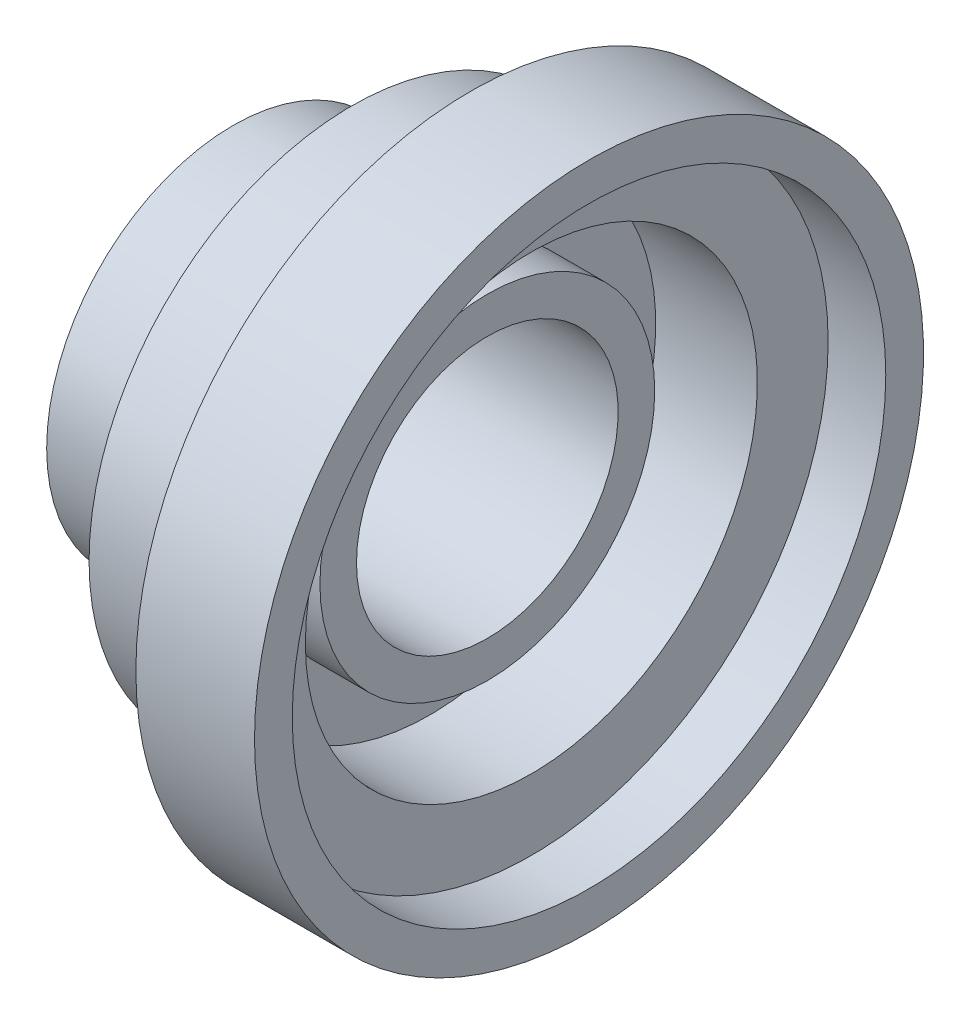
ISO-10303-21;
HEADER;
FILE_DESCRIPTION(('STEP AP214'),'2;1');
FILE_NAME('part.step','',(''),(''),'','','');
FILE_SCHEMA(('AUTOMOTIVE_DESIGN { 1 0 10303 214 1 1 1 1 }'));
ENDSEC;
DATA;
#1=APPLICATION_CONTEXT('core data for automotive mechanical design processes');
#2=APPLICATION_PROTOCOL_DEFINITION('international standard','automotive_design',2000,#1);
#3=PRODUCT_CONTEXT('',#1,'mechanical');
#4=PRODUCT('Part','Part','',(#3));
#5=PRODUCT_RELATED_PRODUCT_CATEGORY('part','',(#4));
#6=PRODUCT_DEFINITION_FORMATION('','',#4);
#7=PRODUCT_DEFINITION_CONTEXT('part definition',#1,'design');
#8=PRODUCT_DEFINITION('design','',#6,#7);
#9=PRODUCT_DEFINITION_SHAPE('','',#8);
#10=(LENGTH_UNIT() NAMED_UNIT(*) SI_UNIT(.MILLI.,.METRE.));
#11=(NAMED_UNIT(*) PLANE_ANGLE_UNIT() SI_UNIT($,.RADIAN.));
#12=(NAMED_UNIT(*) SI_UNIT($,.STERADIAN.) SOLID_ANGLE_UNIT());
#13=UNCERTAINTY_MEASURE_WITH_UNIT(LENGTH_MEASURE(1.E-05),#10,'distance_accuracy_value','');
#14=(GEOMETRIC_REPRESENTATION_CONTEXT(3) GLOBAL_UNCERTAINTY_ASSIGNED_CONTEXT((#13)) GLOBAL_UNIT_ASSIGNED_CONTEXT((#10,
#11,#12)) REPRESENTATION_CONTEXT('',''));
#15=CARTESIAN_POINT('',(0.,0.,0.));
#16=DIRECTION('',(0.,0.,1.));
#17=DIRECTION('',(1.,0.,0.));
#18=AXIS2_PLACEMENT_3D('',#15,#16,#17);
#19=CARTESIAN_POINT('',(0.,-38.5990285898058,0.));
#20=DIRECTION('',(-1.,0.,0.));
#21=DIRECTION('',(0.,0.,1.));
#22=AXIS2_PLACEMENT_3D('',#19,#20,#21);
#23=CYLINDRICAL_SURFACE('',#22,38.5990285898058);
#24=CARTESIAN_POINT('',(75.,-38.5990285898058,0.));
#25=DIRECTION('',(-1.,0.,0.));
#26=DIRECTION('',(0.,0.,1.));
#27=AXIS2_PLACEMENT_3D('',#24,#25,#26);
#28=CIRCLE('',#27,38.5990285898058);
#29=CARTESIAN_POINT('',(75.,-38.5990285898058,38.5990285898058));
#30=VERTEX_POINT('',#29);
#31=EDGE_CURVE('E83',#30,#30,#28,.T.);
#32=ORIENTED_EDGE('',*,*,#31,.F.);
#33=EDGE_LOOP('',(#32));
#34=FACE_BOUND('',#33,.T.);
#35=CARTESIAN_POINT('',(0.,-38.5990285898058,0.));
#36=DIRECTION('',(-1.,0.,0.));
#37=DIRECTION('',(0.,0.,1.));
#38=AXIS2_PLACEMENT_3D('',#35,#36,#37);
#39=CIRCLE('',#38,38.5990285898058);
#40=CARTESIAN_POINT('',(0.,-38.5990285898058,38.5990285898058));
#41=VERTEX_POINT('',#40);
#42=EDGE_CURVE('E10',#41,#41,#39,.T.);
#43=ORIENTED_EDGE('',*,*,#42,.T.);
#44=EDGE_LOOP('',(#43));
#45=FACE_BOUND('',#44,.T.);
#46=ADVANCED_FACE('F37',(#34,#45),#23,.F.);
#47=CARTESIAN_POINT('',(0.,0.,0.));
#48=DIRECTION('',(1.,0.,0.));
#49=DIRECTION('',(0.,0.,-1.));
#50=AXIS2_PLACEMENT_3D('',#47,#48,#49);
#51=PLANE('',#50);
#52=ORIENTED_EDGE('',*,*,#42,.F.);
#53=EDGE_LOOP('',(#52));
#54=FACE_BOUND('',#53,.T.);
#55=CARTESIAN_POINT('',(0.,-38.5990285898058,0.));
#56=DIRECTION('',(-1.,0.,0.));
#57=DIRECTION('',(0.,0.,1.));
#58=AXIS2_PLACEMENT_3D('',#55,#56,#57);
#59=CIRCLE('',#58,55.);
#60=CARTESIAN_POINT('',(0.,-38.5990285898058,55.));
#61=VERTEX_POINT('',#60);
#62=EDGE_CURVE('E43',#61,#61,#59,.T.);
#63=ORIENTED_EDGE('',*,*,#62,.T.);
#64=EDGE_LOOP('',(#63));
#65=FACE_BOUND('',#64,.T.);
#66=ADVANCED_FACE('F90',(#54,#65),#51,.F.);
#67=CARTESIAN_POINT('',(0.,-38.5990285898058,0.));
#68=DIRECTION('',(-1.,0.,0.));
#69=DIRECTION('',(0.,0.,1.));
#70=AXIS2_PLACEMENT_3D('',#67,#68,#69);
#71=CYLINDRICAL_SURFACE('',#70,55.);
#72=ORIENTED_EDGE('',*,*,#62,.F.);
#73=EDGE_LOOP('',(#72));
#74=FACE_BOUND('',#73,.T.);
#75=CARTESIAN_POINT('',(35.,-38.5990285898058,0.));
#76=DIRECTION('',(-1.,0.,0.));
#77=DIRECTION('',(0.,0.,1.));
#78=AXIS2_PLACEMENT_3D('',#75,#76,#77);
#79=CIRCLE('',#78,55.);
#80=CARTESIAN_POINT('',(35.,-38.5990285898058,55.));
#81=VERTEX_POINT('',#80);
#82=EDGE_CURVE('E47',#81,#81,#79,.T.);
#83=ORIENTED_EDGE('',*,*,#82,.T.);
#84=EDGE_LOOP('',(#83));
#85=FACE_BOUND('',#84,.T.);
#86=ADVANCED_FACE('F94',(#74,#85),#71,.T.);
#87=CARTESIAN_POINT('',(35.,16.4009714101942,0.));
#88=DIRECTION('',(1.,0.,0.));
#89=DIRECTION('',(0.,0.,-1.));
#90=AXIS2_PLACEMENT_3D('',#87,#88,#89);
#91=PLANE('',#90);
#92=ORIENTED_EDGE('',*,*,#82,.F.);
#93=EDGE_LOOP('',(#92));
#94=FACE_BOUND('',#93,.T.);
#95=CARTESIAN_POINT('',(35.,-38.5990285898058,0.));
#96=DIRECTION('',(-1.,0.,0.));
#97=DIRECTION('',(0.,0.,1.));
#98=AXIS2_PLACEMENT_3D('',#95,#96,#97);
#99=CIRCLE('',#98,77.5);
#100=CARTESIAN_POINT('',(35.,-38.5990285898058,77.5));
#101=VERTEX_POINT('',#100);
#102=EDGE_CURVE('E51',#101,#101,#99,.T.);
#103=ORIENTED_EDGE('',*,*,#102,.T.);
#104=EDGE_LOOP('',(#103));
#105=FACE_BOUND('',#104,.T.);
#106=ADVANCED_FACE('F99',(#94,#105),#91,.F.);
#107=CARTESIAN_POINT('',(0.,-38.5990285898058,0.));
#108=DIRECTION('',(-1.,0.,0.));
#109=DIRECTION('',(0.,0.,1.));
#110=AXIS2_PLACEMENT_3D('',#107,#108,#109);
#111=CYLINDRICAL_SURFACE('',#110,77.5);
#112=ORIENTED_EDGE('',*,*,#102,.F.);
#113=EDGE_LOOP('',(#112));
#114=FACE_BOUND('',#113,.T.);
#115=CARTESIAN_POINT('',(70.,-38.5990285898058,0.));
#116=DIRECTION('',(-1.,0.,0.));
#117=DIRECTION('',(0.,0.,1.));
#118=AXIS2_PLACEMENT_3D('',#115,#116,#117);
#119=CIRCLE('',#118,77.5);
#120=CARTESIAN_POINT('',(70.,-38.5990285898058,77.5));
#121=VERTEX_POINT('',#120);
#122=EDGE_CURVE('E56',#121,#121,#119,.T.);
#123=ORIENTED_EDGE('',*,*,#122,.T.);
#124=EDGE_LOOP('',(#123));
#125=FACE_BOUND('',#124,.T.);
#126=ADVANCED_FACE('F105',(#114,#125),#111,.T.);
#127=CARTESIAN_POINT('',(70.,38.9009714101942,0.));
#128=DIRECTION('',(1.,0.,0.));
#129=DIRECTION('',(0.,0.,-1.));
#130=AXIS2_PLACEMENT_3D('',#127,#128,#129);
#131=PLANE('',#130);
#132=ORIENTED_EDGE('',*,*,#122,.F.);
#133=EDGE_LOOP('',(#132));
#134=FACE_BOUND('',#133,.T.);
#135=CARTESIAN_POINT('',(70.,-38.5990285898058,0.));
#136=DIRECTION('',(-1.,0.,0.));
#137=DIRECTION('',(0.,0.,1.));
#138=AXIS2_PLACEMENT_3D('',#135,#136,#137);
#139=CIRCLE('',#138,98.6887835516243);
#140=CARTESIAN_POINT('',(70.,-38.5990285898058,98.6887835516243));
#141=VERTEX_POINT('',#140);
#142=EDGE_CURVE('E59',#141,#141,#139,.T.);
#143=ORIENTED_EDGE('',*,*,#142,.T.);
#144=EDGE_LOOP('',(#143));
#145=FACE_BOUND('',#144,.T.);
#146=ADVANCED_FACE('F109',(#134,#145),#131,.F.);
#147=CARTESIAN_POINT('',(0.,-38.5990285898058,0.));
#148=DIRECTION('',(-1.,0.,0.));
#149=DIRECTION('',(0.,0.,1.));
#150=AXIS2_PLACEMENT_3D('',#147,#148,#149);
#151=CYLINDRICAL_SURFACE('',#150,98.6887835516243);
#152=ORIENTED_EDGE('',*,*,#142,.F.);
#153=EDGE_LOOP('',(#152));
#154=FACE_BOUND('',#153,.T.);
#155=CARTESIAN_POINT('',(105.,-38.5990285898058,0.));
#156=DIRECTION('',(-1.,0.,0.));
#157=DIRECTION('',(0.,0.,1.));
#158=AXIS2_PLACEMENT_3D('',#155,#156,#157);
#159=CIRCLE('',#158,98.6887835516243);
#160=CARTESIAN_POINT('',(105.,-38.5990285898058,98.6887835516243));
#161=VERTEX_POINT('',#160);
#162=EDGE_CURVE('E62',#161,#161,#159,.T.);
#163=ORIENTED_EDGE('',*,*,#162,.T.);
#164=EDGE_LOOP('',(#163));
#165=FACE_BOUND('',#164,.T.);
#166=ADVANCED_FACE('F113',(#154,#165),#151,.T.);
#167=CARTESIAN_POINT('',(105.,60.0897549618185,0.));
#168=DIRECTION('',(-1.,0.,0.));
#169=DIRECTION('',(0.,0.,1.));
#170=AXIS2_PLACEMENT_3D('',#167,#168,#169);
#171=PLANE('',#170);
#172=ORIENTED_EDGE('',*,*,#162,.F.);
#173=EDGE_LOOP('',(#172));
#174=FACE_BOUND('',#173,.T.);
#175=CARTESIAN_POINT('',(105.,-38.5990285898058,0.));
#176=DIRECTION('',(-1.,0.,0.));
#177=DIRECTION('',(0.,0.,1.));
#178=AXIS2_PLACEMENT_3D('',#175,#176,#177);
#179=CIRCLE('',#178,87.5494294986501);
#180=CARTESIAN_POINT('',(105.,-38.5990285898058,87.5494294986501));
#181=VERTEX_POINT('',#180);
#182=EDGE_CURVE('E65',#181,#181,#179,.T.);
#183=ORIENTED_EDGE('',*,*,#182,.T.);
#184=EDGE_LOOP('',(#183));
#185=FACE_BOUND('',#184,.T.);
#186=ADVANCED_FACE('F117',(#174,#185),#171,.F.);
#187=CARTESIAN_POINT('',(0.,-38.5990285898058,0.));
#188=DIRECTION('',(-1.,0.,0.));
#189=DIRECTION('',(0.,0.,1.));
#190=AXIS2_PLACEMENT_3D('',#187,#188,#189);
#191=CYLINDRICAL_SURFACE('',#190,87.5494294986501);
#192=ORIENTED_EDGE('',*,*,#182,.F.);
#193=EDGE_LOOP('',(#192));
#194=FACE_BOUND('',#193,.T.);
#195=CARTESIAN_POINT('',(88.,-38.5990285898058,0.));
#196=DIRECTION('',(-1.,0.,0.));
#197=DIRECTION('',(0.,0.,1.));
#198=AXIS2_PLACEMENT_3D('',#195,#196,#197);
#199=CIRCLE('',#198,87.5494294986501);
#200=CARTESIAN_POINT('',(88.,-38.5990285898058,87.5494294986501));
#201=VERTEX_POINT('',#200);
#202=EDGE_CURVE('E68',#201,#201,#199,.T.);
#203=ORIENTED_EDGE('',*,*,#202,.T.);
#204=EDGE_LOOP('',(#203));
#205=FACE_BOUND('',#204,.T.);
#206=ADVANCED_FACE('F121',(#194,#205),#191,.F.);
#207=CARTESIAN_POINT('',(88.,48.9504009088443,0.));
#208=DIRECTION('',(-1.,0.,0.));
#209=DIRECTION('',(0.,0.,1.));
#210=AXIS2_PLACEMENT_3D('',#207,#208,#209);
#211=PLANE('',#210);
#212=ORIENTED_EDGE('',*,*,#202,.F.);
#213=EDGE_LOOP('',(#212));
#214=FACE_BOUND('',#213,.T.);
#215=CARTESIAN_POINT('',(88.,-38.5990285898058,0.));
#216=DIRECTION('',(-1.,0.,0.));
#217=DIRECTION('',(0.,0.,1.));
#218=AXIS2_PLACEMENT_3D('',#215,#216,#217);
#219=CIRCLE('',#218,66.6827521881492);
#220=CARTESIAN_POINT('',(88.,-38.5990285898058,66.6827521881492));
#221=VERTEX_POINT('',#220);
#222=EDGE_CURVE('E71',#221,#221,#219,.T.);
#223=ORIENTED_EDGE('',*,*,#222,.T.);
#224=EDGE_LOOP('',(#223));
#225=FACE_BOUND('',#224,.T.);
#226=ADVANCED_FACE('F125',(#214,#225),#211,.F.);
#227=CARTESIAN_POINT('',(0.,-38.5990285898058,0.));
#228=DIRECTION('',(-1.,0.,0.));
#229=DIRECTION('',(0.,0.,1.));
#230=AXIS2_PLACEMENT_3D('',#227,#228,#229);
#231=CYLINDRICAL_SURFACE('',#230,66.6827521881492);
#232=ORIENTED_EDGE('',*,*,#222,.F.);
#233=EDGE_LOOP('',(#232));
#234=FACE_BOUND('',#233,.T.);
#235=CARTESIAN_POINT('',(58.,-38.5990285898058,0.));
#236=DIRECTION('',(-1.,0.,0.));
#237=DIRECTION('',(0.,0.,1.));
#238=AXIS2_PLACEMENT_3D('',#235,#236,#237);
#239=CIRCLE('',#238,66.6827521881492);
#240=CARTESIAN_POINT('',(58.,-38.5990285898058,66.6827521881492));
#241=VERTEX_POINT('',#240);
#242=EDGE_CURVE('E74',#241,#241,#239,.T.);
#243=ORIENTED_EDGE('',*,*,#242,.T.);
#244=EDGE_LOOP('',(#243));
#245=FACE_BOUND('',#244,.T.);
#246=ADVANCED_FACE('F129',(#234,#245),#231,.F.);
#247=CARTESIAN_POINT('',(58.,28.0837235983434,0.));
#248=DIRECTION('',(-1.,0.,0.));
#249=DIRECTION('',(0.,0.,1.));
#250=AXIS2_PLACEMENT_3D('',#247,#248,#249);
#251=PLANE('',#250);
#252=ORIENTED_EDGE('',*,*,#242,.F.);
#253=EDGE_LOOP('',(#252));
#254=FACE_BOUND('',#253,.T.);
#255=CARTESIAN_POINT('',(58.,-38.5990285898058,0.));
#256=DIRECTION('',(-1.,0.,0.));
#257=DIRECTION('',(0.,0.,1.));
#258=AXIS2_PLACEMENT_3D('',#255,#256,#257);
#259=CIRCLE('',#258,49.3901769826007);
#260=CARTESIAN_POINT('',(58.,-38.5990285898058,49.3901769826007));
#261=VERTEX_POINT('',#260);
#262=EDGE_CURVE('E77',#261,#261,#259,.T.);
#263=ORIENTED_EDGE('',*,*,#262,.T.);
#264=EDGE_LOOP('',(#263));
#265=FACE_BOUND('',#264,.T.);
#266=ADVANCED_FACE('F133',(#254,#265),#251,.F.);
#267=CARTESIAN_POINT('',(0.,-38.5990285898058,0.));
#268=DIRECTION('',(-1.,0.,0.));
#269=DIRECTION('',(0.,0.,1.));
#270=AXIS2_PLACEMENT_3D('',#267,#268,#269);
#271=CYLINDRICAL_SURFACE('',#270,49.3901769826007);
#272=ORIENTED_EDGE('',*,*,#262,.F.);
#273=EDGE_LOOP('',(#272));
#274=FACE_BOUND('',#273,.T.);
#275=CARTESIAN_POINT('',(75.,-38.5990285898058,0.));
#276=DIRECTION('',(-1.,0.,0.));
#277=DIRECTION('',(0.,0.,1.));
#278=AXIS2_PLACEMENT_3D('',#275,#276,#277);
#279=CIRCLE('',#278,49.3901769826007);
#280=CARTESIAN_POINT('',(75.,-38.5990285898058,49.3901769826007));
#281=VERTEX_POINT('',#280);
#282=EDGE_CURVE('E80',#281,#281,#279,.T.);
#283=ORIENTED_EDGE('',*,*,#282,.T.);
#284=EDGE_LOOP('',(#283));
#285=FACE_BOUND('',#284,.T.);
#286=ADVANCED_FACE('F137',(#274,#285),#271,.T.);
#287=CARTESIAN_POINT('',(75.,10.7911483927949,0.));
#288=DIRECTION('',(-1.,0.,0.));
#289=DIRECTION('',(0.,0.,1.));
#290=AXIS2_PLACEMENT_3D('',#287,#288,#289);
#291=PLANE('',#290);
#292=ORIENTED_EDGE('',*,*,#282,.F.);
#293=EDGE_LOOP('',(#292));
#294=FACE_BOUND('',#293,.T.);
#295=ORIENTED_EDGE('',*,*,#31,.T.);
#296=EDGE_LOOP('',(#295));
#297=FACE_BOUND('',#296,.T.);
#298=ADVANCED_FACE('F87',(#294,#297),#291,.F.);
#299=CLOSED_SHELL('',(#46,#66,#86,#106,#126,#146,#166,#186,#206,#226,#246,#266,#286,#298));
#300=MANIFOLD_SOLID_BREP('B2',#299);
#301=ADVANCED_BREP_SHAPE_REPRESENTATION('',(#18,#300),#14);
#302=SHAPE_DEFINITION_REPRESENTATION(#9,#301);
ENDSEC;
END-ISO-10303-21;
